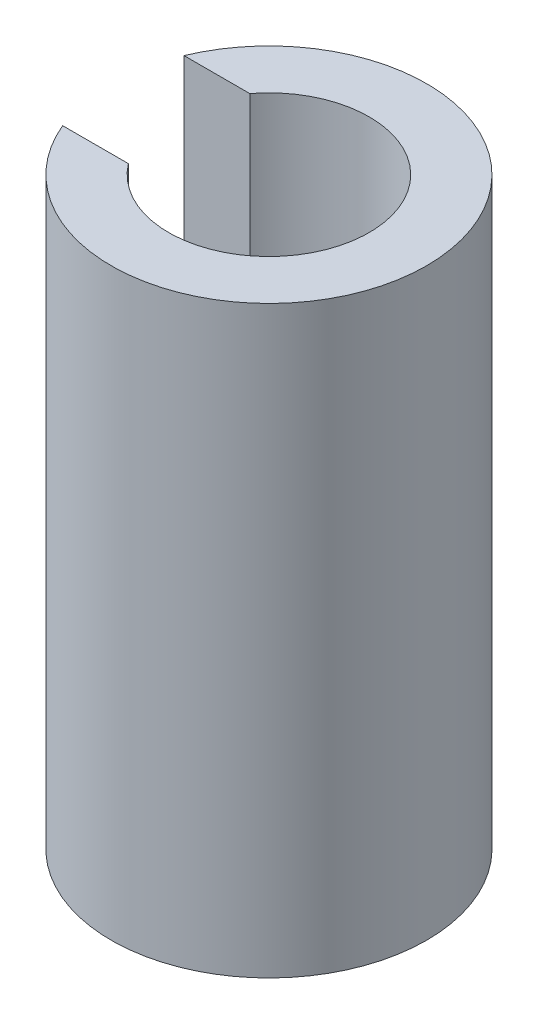
ISO-10303-21;
HEADER;
FILE_DESCRIPTION(('STEP AP214'),'2;1');
FILE_NAME('part.step','',(''),(''),'','','');
FILE_SCHEMA(('AUTOMOTIVE_DESIGN { 1 0 10303 214 1 1 1 1 }'));
ENDSEC;
DATA;
#1=APPLICATION_CONTEXT('core data for automotive mechanical design processes');
#2=APPLICATION_PROTOCOL_DEFINITION('international standard','automotive_design',2000,#1);
#3=PRODUCT_CONTEXT('',#1,'mechanical');
#4=PRODUCT('Part','Part','',(#3));
#5=PRODUCT_RELATED_PRODUCT_CATEGORY('part','',(#4));
#6=PRODUCT_DEFINITION_FORMATION('','',#4);
#7=PRODUCT_DEFINITION_CONTEXT('part definition',#1,'design');
#8=PRODUCT_DEFINITION('design','',#6,#7);
#9=PRODUCT_DEFINITION_SHAPE('','',#8);
#10=(LENGTH_UNIT() NAMED_UNIT(*) SI_UNIT(.MILLI.,.METRE.));
#11=(NAMED_UNIT(*) PLANE_ANGLE_UNIT() SI_UNIT($,.RADIAN.));
#12=(NAMED_UNIT(*) SI_UNIT($,.STERADIAN.) SOLID_ANGLE_UNIT());
#13=UNCERTAINTY_MEASURE_WITH_UNIT(LENGTH_MEASURE(1.E-05),#10,'distance_accuracy_value','');
#14=(GEOMETRIC_REPRESENTATION_CONTEXT(3) GLOBAL_UNCERTAINTY_ASSIGNED_CONTEXT((#13)) GLOBAL_UNIT_ASSIGNED_CONTEXT((#10,
#11,#12)) REPRESENTATION_CONTEXT('',''));
#15=CARTESIAN_POINT('',(0.,0.,0.));
#16=DIRECTION('',(0.,0.,1.));
#17=DIRECTION('',(1.,0.,0.));
#18=AXIS2_PLACEMENT_3D('',#15,#16,#17);
#19=CARTESIAN_POINT('',(0.,15.,0.));
#20=DIRECTION('',(0.,1.,0.));
#21=DIRECTION('',(0.,0.,1.));
#22=AXIS2_PLACEMENT_3D('',#19,#20,#21);
#23=PLANE('',#22);
#24=DIRECTION('',(-1.,0.,0.));
#25=VECTOR('',#24,1.);
#26=CARTESIAN_POINT('',(-4.05,15.,-1.55824420422474));
#27=LINE('',#26,#25);
#28=CARTESIAN_POINT('',(-2.05,15.,-1.55824420422474));
#29=VERTEX_POINT('',#28);
#30=CARTESIAN_POINT('',(-3.73823153376031,15.,-1.55824420422474));
#31=VERTEX_POINT('',#30);
#32=EDGE_CURVE('E97',#29,#31,#27,.T.);
#33=ORIENTED_EDGE('',*,*,#32,.F.);
#34=CARTESIAN_POINT('',(0.,15.,0.));
#35=DIRECTION('',(0.,1.,0.));
#36=DIRECTION('',(0.,0.,1.));
#37=AXIS2_PLACEMENT_3D('',#34,#35,#36);
#38=CIRCLE('',#37,2.575);
#39=CARTESIAN_POINT('',(-2.05,15.,1.55824420422474));
#40=VERTEX_POINT('',#39);
#41=EDGE_CURVE('E101',#40,#29,#38,.T.);
#42=ORIENTED_EDGE('',*,*,#41,.F.);
#43=DIRECTION('',(1.,0.,0.));
#44=VECTOR('',#43,1.);
#45=CARTESIAN_POINT('',(-4.05,15.,1.55824420422474));
#46=LINE('',#45,#44);
#47=CARTESIAN_POINT('',(-3.73823153376031,15.,1.55824420422474));
#48=VERTEX_POINT('',#47);
#49=EDGE_CURVE('E63',#48,#40,#46,.T.);
#50=ORIENTED_EDGE('',*,*,#49,.F.);
#51=CARTESIAN_POINT('',(0.,15.,0.));
#52=DIRECTION('',(0.,1.,0.));
#53=DIRECTION('',(0.,0.,1.));
#54=AXIS2_PLACEMENT_3D('',#51,#52,#53);
#55=CIRCLE('',#54,4.05);
#56=EDGE_CURVE('E11',#48,#31,#55,.T.);
#57=ORIENTED_EDGE('',*,*,#56,.T.);
#58=EDGE_LOOP('',(#33,#42,#50,#57));
#59=FACE_BOUND('',#58,.T.);
#60=ADVANCED_FACE('F39',(#59),#23,.T.);
#61=CARTESIAN_POINT('',(0.,0.,0.));
#62=DIRECTION('',(0.,1.,0.));
#63=DIRECTION('',(0.,0.,1.));
#64=AXIS2_PLACEMENT_3D('',#61,#62,#63);
#65=PLANE('',#64);
#66=CARTESIAN_POINT('',(0.,0.,0.));
#67=DIRECTION('',(0.,1.,0.));
#68=DIRECTION('',(0.,0.,1.));
#69=AXIS2_PLACEMENT_3D('',#66,#67,#68);
#70=CIRCLE('',#69,2.575);
#71=CARTESIAN_POINT('',(-2.05,0.,1.55824420422474));
#72=VERTEX_POINT('',#71);
#73=CARTESIAN_POINT('',(-2.05,0.,-1.55824420422474));
#74=VERTEX_POINT('',#73);
#75=EDGE_CURVE('E94',#72,#74,#70,.T.);
#76=ORIENTED_EDGE('',*,*,#75,.T.);
#77=DIRECTION('',(-1.,0.,0.));
#78=VECTOR('',#77,1.);
#79=CARTESIAN_POINT('',(-4.05,0.,-1.55824420422474));
#80=LINE('',#79,#78);
#81=CARTESIAN_POINT('',(-3.73823153376031,0.,-1.55824420422474));
#82=VERTEX_POINT('',#81);
#83=EDGE_CURVE('E55',#74,#82,#80,.T.);
#84=ORIENTED_EDGE('',*,*,#83,.T.);
#85=CARTESIAN_POINT('',(0.,0.,0.));
#86=DIRECTION('',(0.,1.,0.));
#87=DIRECTION('',(0.,0.,1.));
#88=AXIS2_PLACEMENT_3D('',#85,#86,#87);
#89=CIRCLE('',#88,4.05);
#90=CARTESIAN_POINT('',(-3.73823153376031,0.,1.55824420422474));
#91=VERTEX_POINT('',#90);
#92=EDGE_CURVE('E43',#91,#82,#89,.T.);
#93=ORIENTED_EDGE('',*,*,#92,.F.);
#94=DIRECTION('',(1.,0.,0.));
#95=VECTOR('',#94,1.);
#96=CARTESIAN_POINT('',(-4.05,0.,1.55824420422474));
#97=LINE('',#96,#95);
#98=EDGE_CURVE('E81',#91,#72,#97,.T.);
#99=ORIENTED_EDGE('',*,*,#98,.T.);
#100=EDGE_LOOP('',(#76,#84,#93,#99));
#101=FACE_BOUND('',#100,.T.);
#102=ADVANCED_FACE('F93',(#101),#65,.F.);
#103=CARTESIAN_POINT('',(0.,15.,0.));
#104=DIRECTION('',(0.,-1.,0.));
#105=DIRECTION('',(0.,0.,-1.));
#106=AXIS2_PLACEMENT_3D('',#103,#104,#105);
#107=CYLINDRICAL_SURFACE('',#106,4.05);
#108=ORIENTED_EDGE('',*,*,#92,.T.);
#109=DIRECTION('',(0.,-1.,0.));
#110=VECTOR('',#109,1.);
#111=CARTESIAN_POINT('',(-3.73823153376031,15.,-1.55824420422474));
#112=LINE('',#111,#110);
#113=EDGE_CURVE('E102',#82,#31,#112,.F.);
#114=ORIENTED_EDGE('',*,*,#113,.T.);
#115=ORIENTED_EDGE('',*,*,#56,.F.);
#116=DIRECTION('',(0.,-1.,0.));
#117=VECTOR('',#116,1.);
#118=CARTESIAN_POINT('',(-3.73823153376031,15.,1.55824420422474));
#119=LINE('',#118,#117);
#120=EDGE_CURVE('E108',#48,#91,#119,.T.);
#121=ORIENTED_EDGE('',*,*,#120,.T.);
#122=EDGE_LOOP('',(#108,#114,#115,#121));
#123=FACE_BOUND('',#122,.T.);
#124=ADVANCED_FACE('F41',(#123),#107,.T.);
#125=CARTESIAN_POINT('',(0.,15.,0.));
#126=DIRECTION('',(0.,-1.,0.));
#127=DIRECTION('',(0.,0.,-1.));
#128=AXIS2_PLACEMENT_3D('',#125,#126,#127);
#129=CYLINDRICAL_SURFACE('',#128,2.575);
#130=DIRECTION('',(0.,1.,0.));
#131=VECTOR('',#130,1.);
#132=CARTESIAN_POINT('',(-2.05,0.,-1.55824420422474));
#133=LINE('',#132,#131);
#134=EDGE_CURVE('E88',#74,#29,#133,.T.);
#135=ORIENTED_EDGE('',*,*,#134,.F.);
#136=ORIENTED_EDGE('',*,*,#75,.F.);
#137=DIRECTION('',(0.,1.,0.));
#138=VECTOR('',#137,1.);
#139=CARTESIAN_POINT('',(-2.05,0.,1.55824420422474));
#140=LINE('',#139,#138);
#141=EDGE_CURVE('E78',#72,#40,#140,.T.);
#142=ORIENTED_EDGE('',*,*,#141,.T.);
#143=ORIENTED_EDGE('',*,*,#41,.T.);
#144=EDGE_LOOP('',(#135,#136,#142,#143));
#145=FACE_BOUND('',#144,.T.);
#146=ADVANCED_FACE('F99',(#145),#129,.F.);
#147=CARTESIAN_POINT('',(-4.05,0.,1.55824420422474));
#148=DIRECTION('',(0.,0.,1.));
#149=DIRECTION('',(1.,0.,0.));
#150=AXIS2_PLACEMENT_3D('',#147,#148,#149);
#151=PLANE('',#150);
#152=ORIENTED_EDGE('',*,*,#49,.T.);
#153=ORIENTED_EDGE('',*,*,#141,.F.);
#154=ORIENTED_EDGE('',*,*,#98,.F.);
#155=ORIENTED_EDGE('',*,*,#120,.F.);
#156=EDGE_LOOP('',(#152,#153,#154,#155));
#157=FACE_BOUND('',#156,.T.);
#158=ADVANCED_FACE('F80',(#157),#151,.F.);
#159=CARTESIAN_POINT('',(-4.05,0.,-1.55824420422474));
#160=DIRECTION('',(0.,0.,-1.));
#161=DIRECTION('',(-1.,0.,0.));
#162=AXIS2_PLACEMENT_3D('',#159,#160,#161);
#163=PLANE('',#162);
#164=ORIENTED_EDGE('',*,*,#83,.F.);
#165=ORIENTED_EDGE('',*,*,#134,.T.);
#166=ORIENTED_EDGE('',*,*,#32,.T.);
#167=ORIENTED_EDGE('',*,*,#113,.F.);
#168=EDGE_LOOP('',(#164,#165,#166,#167));
#169=FACE_BOUND('',#168,.T.);
#170=ADVANCED_FACE('F125',(#169),#163,.F.);
#171=CLOSED_SHELL('',(#60,#102,#124,#146,#158,#170));
#172=MANIFOLD_SOLID_BREP('B2',#171);
#173=ADVANCED_BREP_SHAPE_REPRESENTATION('',(#18,#172),#14);
#174=SHAPE_DEFINITION_REPRESENTATION(#9,#173);
ENDSEC;
END-ISO-10303-21;
